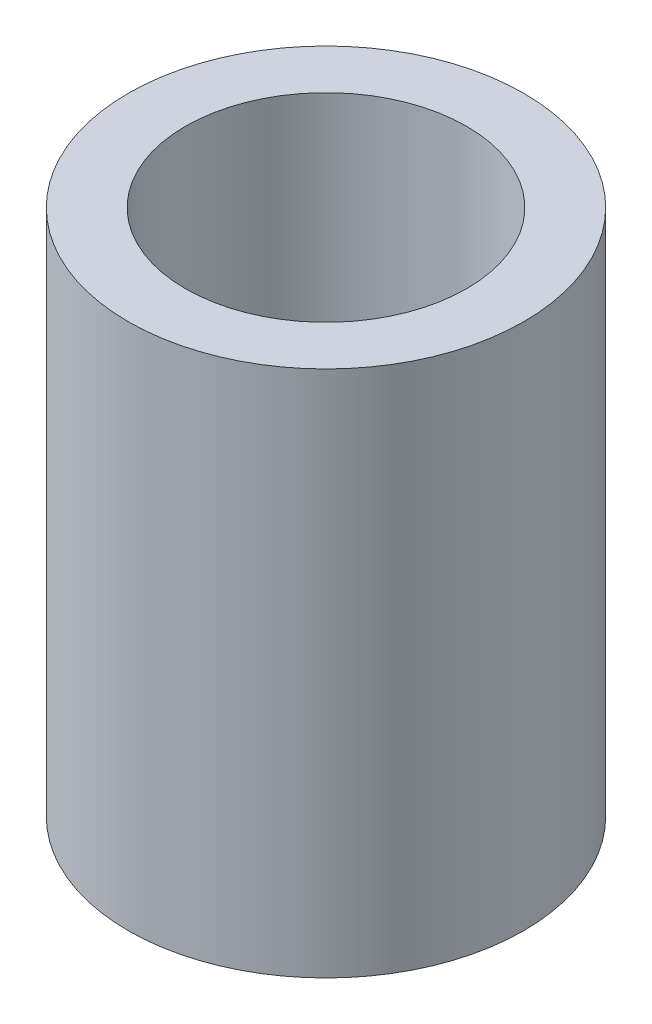
ISO-10303-21;
HEADER;
FILE_DESCRIPTION(('STEP AP214'),'2;1');
FILE_NAME('part.step','',(''),(''),'','','');
FILE_SCHEMA(('AUTOMOTIVE_DESIGN { 1 0 10303 214 1 1 1 1 }'));
ENDSEC;
DATA;
#1=APPLICATION_CONTEXT('core data for automotive mechanical design processes');
#2=APPLICATION_PROTOCOL_DEFINITION('international standard','automotive_design',2000,#1);
#3=PRODUCT_CONTEXT('',#1,'mechanical');
#4=PRODUCT('Part','Part','',(#3));
#5=PRODUCT_RELATED_PRODUCT_CATEGORY('part','',(#4));
#6=PRODUCT_DEFINITION_FORMATION('','',#4);
#7=PRODUCT_DEFINITION_CONTEXT('part definition',#1,'design');
#8=PRODUCT_DEFINITION('design','',#6,#7);
#9=PRODUCT_DEFINITION_SHAPE('','',#8);
#10=(LENGTH_UNIT() NAMED_UNIT(*) SI_UNIT(.MILLI.,.METRE.));
#11=(NAMED_UNIT(*) PLANE_ANGLE_UNIT() SI_UNIT($,.RADIAN.));
#12=(NAMED_UNIT(*) SI_UNIT($,.STERADIAN.) SOLID_ANGLE_UNIT());
#13=UNCERTAINTY_MEASURE_WITH_UNIT(LENGTH_MEASURE(1.E-05),#10,'distance_accuracy_value','');
#14=(GEOMETRIC_REPRESENTATION_CONTEXT(3) GLOBAL_UNCERTAINTY_ASSIGNED_CONTEXT((#13)) GLOBAL_UNIT_ASSIGNED_CONTEXT((#10,
#11,#12)) REPRESENTATION_CONTEXT('',''));
#15=CARTESIAN_POINT('',(0.,0.,0.));
#16=DIRECTION('',(0.,0.,1.));
#17=DIRECTION('',(1.,0.,0.));
#18=AXIS2_PLACEMENT_3D('',#15,#16,#17);
#19=CARTESIAN_POINT('',(0.,6.,0.));
#20=DIRECTION('',(0.,1.,0.));
#21=DIRECTION('',(0.,0.,1.));
#22=AXIS2_PLACEMENT_3D('',#19,#20,#21);
#23=PLANE('',#22);
#24=CARTESIAN_POINT('',(0.,6.,0.));
#25=DIRECTION('',(0.,1.,0.));
#26=DIRECTION('',(0.,0.,1.));
#27=AXIS2_PLACEMENT_3D('',#24,#25,#26);
#28=CIRCLE('',#27,2.25);
#29=CARTESIAN_POINT('',(0.,6.,2.25));
#30=VERTEX_POINT('',#29);
#31=EDGE_CURVE('E10',#30,#30,#28,.T.);
#32=ORIENTED_EDGE('',*,*,#31,.T.);
#33=EDGE_LOOP('',(#32));
#34=FACE_BOUND('',#33,.T.);
#35=CARTESIAN_POINT('',(0.,6.,0.));
#36=DIRECTION('',(0.,1.,0.));
#37=DIRECTION('',(0.,0.,1.));
#38=AXIS2_PLACEMENT_3D('',#35,#36,#37);
#39=CIRCLE('',#38,1.6);
#40=CARTESIAN_POINT('',(0.,6.,1.6));
#41=VERTEX_POINT('',#40);
#42=EDGE_CURVE('E41',#41,#41,#39,.T.);
#43=ORIENTED_EDGE('',*,*,#42,.F.);
#44=EDGE_LOOP('',(#43));
#45=FACE_BOUND('',#44,.T.);
#46=ADVANCED_FACE('F30',(#34,#45),#23,.T.);
#47=CARTESIAN_POINT('',(0.,0.,0.));
#48=DIRECTION('',(0.,1.,0.));
#49=DIRECTION('',(0.,0.,1.));
#50=AXIS2_PLACEMENT_3D('',#47,#48,#49);
#51=PLANE('',#50);
#52=CARTESIAN_POINT('',(0.,0.,0.));
#53=DIRECTION('',(0.,1.,0.));
#54=DIRECTION('',(0.,0.,1.));
#55=AXIS2_PLACEMENT_3D('',#52,#53,#54);
#56=CIRCLE('',#55,2.25);
#57=CARTESIAN_POINT('',(0.,0.,2.25));
#58=VERTEX_POINT('',#57);
#59=EDGE_CURVE('E34',#58,#58,#56,.T.);
#60=ORIENTED_EDGE('',*,*,#59,.F.);
#61=EDGE_LOOP('',(#60));
#62=FACE_BOUND('',#61,.T.);
#63=CARTESIAN_POINT('',(0.,0.,0.));
#64=DIRECTION('',(0.,1.,0.));
#65=DIRECTION('',(0.,0.,1.));
#66=AXIS2_PLACEMENT_3D('',#63,#64,#65);
#67=CIRCLE('',#66,1.6);
#68=CARTESIAN_POINT('',(0.,0.,1.6));
#69=VERTEX_POINT('',#68);
#70=EDGE_CURVE('E43',#69,#69,#67,.T.);
#71=ORIENTED_EDGE('',*,*,#70,.T.);
#72=EDGE_LOOP('',(#71));
#73=FACE_BOUND('',#72,.T.);
#74=ADVANCED_FACE('F53',(#62,#73),#51,.F.);
#75=CARTESIAN_POINT('',(0.,6.,0.));
#76=DIRECTION('',(0.,-1.,0.));
#77=DIRECTION('',(0.,0.,-1.));
#78=AXIS2_PLACEMENT_3D('',#75,#76,#77);
#79=CYLINDRICAL_SURFACE('',#78,2.25);
#80=ORIENTED_EDGE('',*,*,#31,.F.);
#81=EDGE_LOOP('',(#80));
#82=FACE_BOUND('',#81,.T.);
#83=ORIENTED_EDGE('',*,*,#59,.T.);
#84=EDGE_LOOP('',(#83));
#85=FACE_BOUND('',#84,.T.);
#86=ADVANCED_FACE('F32',(#82,#85),#79,.T.);
#87=CARTESIAN_POINT('',(0.,6.,0.));
#88=DIRECTION('',(0.,-1.,0.));
#89=DIRECTION('',(0.,0.,-1.));
#90=AXIS2_PLACEMENT_3D('',#87,#88,#89);
#91=CYLINDRICAL_SURFACE('',#90,1.6);
#92=ORIENTED_EDGE('',*,*,#42,.T.);
#93=EDGE_LOOP('',(#92));
#94=FACE_BOUND('',#93,.T.);
#95=ORIENTED_EDGE('',*,*,#70,.F.);
#96=EDGE_LOOP('',(#95));
#97=FACE_BOUND('',#96,.T.);
#98=ADVANCED_FACE('F49',(#94,#97),#91,.F.);
#99=CLOSED_SHELL('',(#46,#74,#86,#98));
#100=MANIFOLD_SOLID_BREP('B2',#99);
#101=ADVANCED_BREP_SHAPE_REPRESENTATION('',(#18,#100),#14);
#102=SHAPE_DEFINITION_REPRESENTATION(#9,#101);
ENDSEC;
END-ISO-10303-21;
